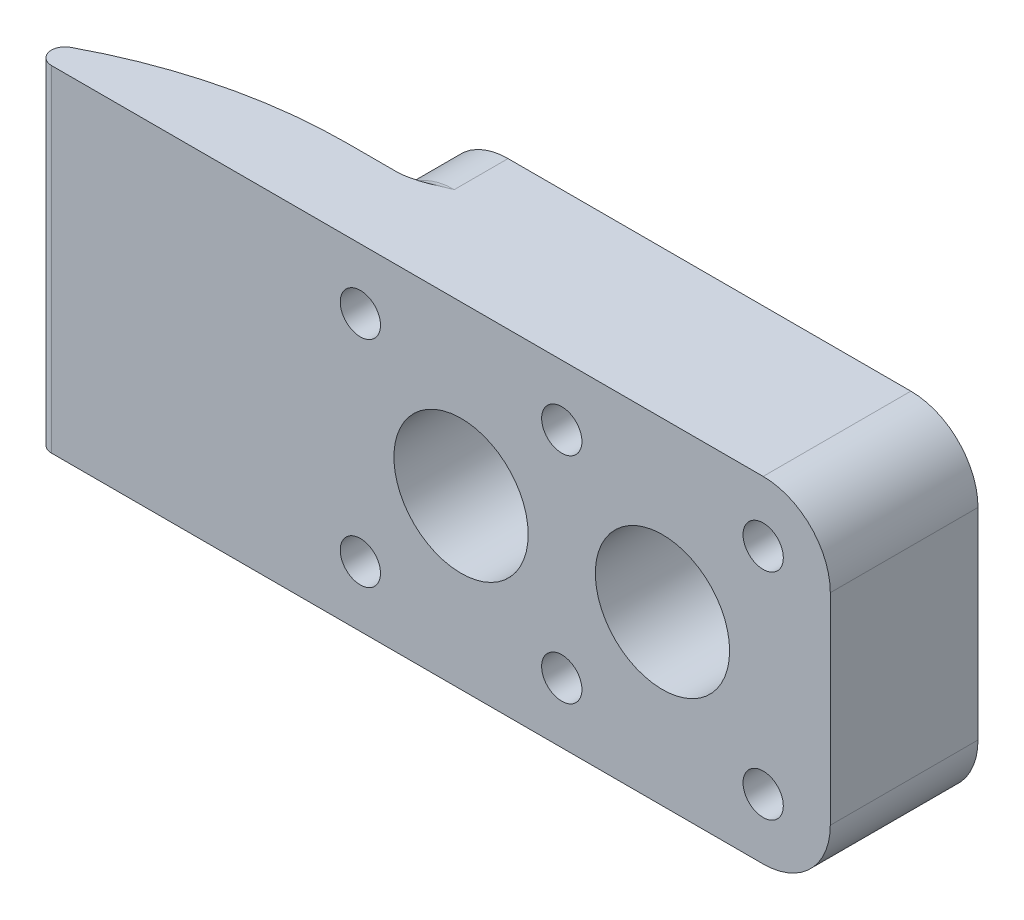
ISO-10303-21;
HEADER;
FILE_DESCRIPTION(('STEP AP214'),'2;1');
FILE_NAME('part.step','',(''),(''),'','','');
FILE_SCHEMA(('AUTOMOTIVE_DESIGN { 1 0 10303 214 1 1 1 1 }'));
ENDSEC;
DATA;
#1=APPLICATION_CONTEXT('core data for automotive mechanical design processes');
#2=APPLICATION_PROTOCOL_DEFINITION('international standard','automotive_design',2000,#1);
#3=PRODUCT_CONTEXT('',#1,'mechanical');
#4=PRODUCT('Part','Part','',(#3));
#5=PRODUCT_RELATED_PRODUCT_CATEGORY('part','',(#4));
#6=PRODUCT_DEFINITION_FORMATION('','',#4);
#7=PRODUCT_DEFINITION_CONTEXT('part definition',#1,'design');
#8=PRODUCT_DEFINITION('design','',#6,#7);
#9=PRODUCT_DEFINITION_SHAPE('','',#8);
#10=(LENGTH_UNIT() NAMED_UNIT(*) SI_UNIT(.MILLI.,.METRE.));
#11=(NAMED_UNIT(*) PLANE_ANGLE_UNIT() SI_UNIT($,.RADIAN.));
#12=(NAMED_UNIT(*) SI_UNIT($,.STERADIAN.) SOLID_ANGLE_UNIT());
#13=UNCERTAINTY_MEASURE_WITH_UNIT(LENGTH_MEASURE(1.E-05),#10,'distance_accuracy_value','');
#14=(GEOMETRIC_REPRESENTATION_CONTEXT(3) GLOBAL_UNCERTAINTY_ASSIGNED_CONTEXT((#13)) GLOBAL_UNIT_ASSIGNED_CONTEXT((#10,
#11,#12)) REPRESENTATION_CONTEXT('',''));
#15=CARTESIAN_POINT('',(0.,0.,0.));
#16=DIRECTION('',(0.,0.,1.));
#17=DIRECTION('',(1.,0.,0.));
#18=AXIS2_PLACEMENT_3D('',#15,#16,#17);
#19=CARTESIAN_POINT('',(20.,-12.5,5.));
#20=DIRECTION('',(-1.,0.,0.));
#21=DIRECTION('',(0.,0.,1.));
#22=AXIS2_PLACEMENT_3D('',#19,#20,#21);
#23=PLANE('',#22);
#24=DIRECTION('',(0.,1.,0.));
#25=VECTOR('',#24,1.);
#26=CARTESIAN_POINT('',(20.,-12.5,11.));
#27=LINE('',#26,#25);
#28=CARTESIAN_POINT('',(20.,-7.5,11.));
#29=VERTEX_POINT('',#28);
#30=CARTESIAN_POINT('',(20.,7.5,11.));
#31=VERTEX_POINT('',#30);
#32=EDGE_CURVE('E186',#29,#31,#27,.T.);
#33=ORIENTED_EDGE('',*,*,#32,.F.);
#34=DIRECTION('',(0.,0.,-1.));
#35=VECTOR('',#34,1.);
#36=CARTESIAN_POINT('',(20.,-7.5,5.));
#37=LINE('',#36,#35);
#38=CARTESIAN_POINT('',(20.,-7.5,0.));
#39=VERTEX_POINT('',#38);
#40=EDGE_CURVE('E230',#29,#39,#37,.T.);
#41=ORIENTED_EDGE('',*,*,#40,.T.);
#42=DIRECTION('',(0.,1.,0.));
#43=VECTOR('',#42,1.);
#44=CARTESIAN_POINT('',(20.,-12.5,0.));
#45=LINE('',#44,#43);
#46=CARTESIAN_POINT('',(20.,7.5,0.));
#47=VERTEX_POINT('',#46);
#48=EDGE_CURVE('E216',#39,#47,#45,.T.);
#49=ORIENTED_EDGE('',*,*,#48,.T.);
#50=DIRECTION('',(0.,0.,-1.));
#51=VECTOR('',#50,1.);
#52=CARTESIAN_POINT('',(20.,7.5,5.));
#53=LINE('',#52,#51);
#54=EDGE_CURVE('E228',#47,#31,#53,.F.);
#55=ORIENTED_EDGE('',*,*,#54,.T.);
#56=EDGE_LOOP('',(#33,#41,#49,#55));
#57=FACE_BOUND('',#56,.T.);
#58=ADVANCED_FACE('F47',(#57),#23,.F.);
#59=CARTESIAN_POINT('',(-20.,12.5,5.));
#60=DIRECTION('',(0.,-1.,0.));
#61=DIRECTION('',(0.,0.,-1.));
#62=AXIS2_PLACEMENT_3D('',#59,#60,#61);
#63=PLANE('',#62);
#64=DIRECTION('',(1.,0.,0.));
#65=VECTOR('',#64,1.);
#66=CARTESIAN_POINT('',(-38.,12.5,11.));
#67=LINE('',#66,#65);
#68=CARTESIAN_POINT('',(-38.,12.5,11.));
#69=VERTEX_POINT('',#68);
#70=CARTESIAN_POINT('',(15.,12.5,11.));
#71=VERTEX_POINT('',#70);
#72=EDGE_CURVE('E173',#69,#71,#67,.T.);
#73=ORIENTED_EDGE('',*,*,#72,.T.);
#74=DIRECTION('',(0.,0.,-1.));
#75=VECTOR('',#74,1.);
#76=CARTESIAN_POINT('',(15.,12.5,5.));
#77=LINE('',#76,#75);
#78=CARTESIAN_POINT('',(15.,12.5,0.));
#79=VERTEX_POINT('',#78);
#80=EDGE_CURVE('E251',#71,#79,#77,.T.);
#81=ORIENTED_EDGE('',*,*,#80,.T.);
#82=DIRECTION('',(-1.,0.,0.));
#83=VECTOR('',#82,1.);
#84=CARTESIAN_POINT('',(-20.,12.5,0.));
#85=LINE('',#84,#83);
#86=CARTESIAN_POINT('',(-15.,12.5,0.));
#87=VERTEX_POINT('',#86);
#88=EDGE_CURVE('E219',#79,#87,#85,.T.);
#89=ORIENTED_EDGE('',*,*,#88,.T.);
#90=DIRECTION('',(0.,0.,-1.));
#91=VECTOR('',#90,1.);
#92=CARTESIAN_POINT('',(-15.,12.5,5.));
#93=LINE('',#92,#91);
#94=CARTESIAN_POINT('',(-15.,12.5,4.));
#95=VERTEX_POINT('',#94);
#96=EDGE_CURVE('E249',#87,#95,#93,.F.);
#97=ORIENTED_EDGE('',*,*,#96,.T.);
#98=CARTESIAN_POINT('',(-18.3166247903554,12.5,5.));
#99=CARTESIAN_POINT('',(-18.2549448261903,12.5,4.99999265512221));
#100=CARTESIAN_POINT('',(-18.193289628128,12.5,4.99825737047964));
#101=CARTESIAN_POINT('',(-18.0701784766119,12.5,4.99167927723074));
#102=CARTESIAN_POINT('',(-18.008722427822,12.5,4.98683828413488));
#103=CARTESIAN_POINT('',(-17.8251331306329,12.5,4.96821224203621));
#104=CARTESIAN_POINT('',(-17.7034115701283,12.5,4.95031992154772));
#105=CARTESIAN_POINT('',(-17.4629728841531,12.5,4.9060386621475));
#106=CARTESIAN_POINT('',(-17.3442374506728,12.5,4.87974501632872));
#107=CARTESIAN_POINT('',(-17.1084146178438,12.5,4.82030252267247));
#108=CARTESIAN_POINT('',(-16.9913286795946,12.5,4.78714796093698));
#109=CARTESIAN_POINT('',(-16.715511240989,12.5,4.70207510058664));
#110=CARTESIAN_POINT('',(-16.5575238418841,12.5,4.64776910285634));
#111=CARTESIAN_POINT('',(-16.2441555047057,12.5,4.53204394783015));
#112=CARTESIAN_POINT('',(-16.0887756970545,12.5,4.47062179236275));
#113=CARTESIAN_POINT('',(-15.6246300367061,12.5,4.27926384080313));
#114=CARTESIAN_POINT('',(-15.3187158206686,12.5,4.14253295536927));
#115=CARTESIAN_POINT('',(-15.0086066187974,12.5,4.00384898305027));
#116=CARTESIAN_POINT('',(-15.0043033038078,12.5,4.00192448179496));
#117=CARTESIAN_POINT('',(-15.,12.5,4.));
#118=B_SPLINE_CURVE_WITH_KNOTS('',3,(#98,#99,#100,#101,#102,#103,#104,#105,#106,#107,#108,#109,
#110,#111,#112,#113,#114,#115,#116,#117),.UNSPECIFIED.,.F.,.F.,(4,2,2,2,2,2,2,2,2,4),(0.,
0.184977192336478,0.369846350576886,0.73848758309796,1.10308764090425,1.46799257532018,
1.96890994139302,2.47003912618659,3.47501470229637,3.48915683792114),.UNSPECIFIED.);
#119=CARTESIAN_POINT('',(-18.3166247903554,12.5,5.));
#120=VERTEX_POINT('',#119);
#121=EDGE_CURVE('E57',#95,#120,#118,.F.);
#122=ORIENTED_EDGE('',*,*,#121,.T.);
#123=DIRECTION('',(-1.,0.,0.));
#124=VECTOR('',#123,1.);
#125=CARTESIAN_POINT('',(-20.,12.5,5.));
#126=LINE('',#125,#124);
#127=CARTESIAN_POINT('',(-22.,12.5,5.));
#128=VERTEX_POINT('',#127);
#129=EDGE_CURVE('E145',#120,#128,#126,.T.);
#130=ORIENTED_EDGE('',*,*,#129,.T.);
#131=CARTESIAN_POINT('',(-22.,12.5,40.));
#132=DIRECTION('',(0.,1.,0.));
#133=DIRECTION('',(0.,0.,-1.));
#134=AXIS2_PLACEMENT_3D('',#131,#132,#133);
#135=CIRCLE('',#134,35.);
#136=CARTESIAN_POINT('',(-38.4705882352941,12.5,9.11764705882354));
#137=VERTEX_POINT('',#136);
#138=EDGE_CURVE('E151',#128,#137,#135,.T.);
#139=ORIENTED_EDGE('',*,*,#138,.T.);
#140=CARTESIAN_POINT('',(-38.,12.5,10.));
#141=DIRECTION('',(0.,1.,0.));
#142=DIRECTION('',(0.,0.,1.));
#143=AXIS2_PLACEMENT_3D('',#140,#141,#142);
#144=CIRCLE('',#143,1.);
#145=EDGE_CURVE('E171',#137,#69,#144,.T.);
#146=ORIENTED_EDGE('',*,*,#145,.T.);
#147=EDGE_LOOP('',(#73,#81,#89,#97,#122,#130,#139,#146));
#148=FACE_BOUND('',#147,.T.);
#149=ADVANCED_FACE('F148',(#148),#63,.F.);
#150=CARTESIAN_POINT('',(-20.,-12.5,5.));
#151=DIRECTION('',(1.,0.,0.));
#152=DIRECTION('',(0.,0.,-1.));
#153=AXIS2_PLACEMENT_3D('',#150,#151,#152);
#154=PLANE('',#153);
#155=DIRECTION('',(0.,0.,-1.));
#156=VECTOR('',#155,1.);
#157=CARTESIAN_POINT('',(-20.,-7.5,5.));
#158=LINE('',#157,#156);
#159=CARTESIAN_POINT('',(-20.,-7.5,0.));
#160=VERTEX_POINT('',#159);
#161=CARTESIAN_POINT('',(-20.,-7.5,4.));
#162=VERTEX_POINT('',#161);
#163=EDGE_CURVE('E256',#160,#162,#158,.F.);
#164=ORIENTED_EDGE('',*,*,#163,.T.);
#165=DIRECTION('',(0.,-1.,0.));
#166=VECTOR('',#165,1.);
#167=CARTESIAN_POINT('',(-20.,-12.5,4.));
#168=LINE('',#167,#166);
#169=CARTESIAN_POINT('',(-20.,7.5,4.));
#170=VERTEX_POINT('',#169);
#171=EDGE_CURVE('E267',#162,#170,#168,.F.);
#172=ORIENTED_EDGE('',*,*,#171,.T.);
#173=DIRECTION('',(0.,0.,-1.));
#174=VECTOR('',#173,1.);
#175=CARTESIAN_POINT('',(-20.,7.5,5.));
#176=LINE('',#175,#174);
#177=CARTESIAN_POINT('',(-20.,7.5,0.));
#178=VERTEX_POINT('',#177);
#179=EDGE_CURVE('E254',#170,#178,#176,.T.);
#180=ORIENTED_EDGE('',*,*,#179,.T.);
#181=DIRECTION('',(0.,-1.,0.));
#182=VECTOR('',#181,1.);
#183=CARTESIAN_POINT('',(-20.,-12.5,0.));
#184=LINE('',#183,#182);
#185=EDGE_CURVE('E222',#178,#160,#184,.T.);
#186=ORIENTED_EDGE('',*,*,#185,.T.);
#187=EDGE_LOOP('',(#164,#172,#180,#186));
#188=FACE_BOUND('',#187,.T.);
#189=ADVANCED_FACE('F287',(#188),#154,.F.);
#190=CARTESIAN_POINT('',(-20.,-12.5,5.));
#191=DIRECTION('',(0.,1.,0.));
#192=DIRECTION('',(0.,0.,1.));
#193=AXIS2_PLACEMENT_3D('',#190,#191,#192);
#194=PLANE('',#193);
#195=DIRECTION('',(1.,0.,0.));
#196=VECTOR('',#195,1.);
#197=CARTESIAN_POINT('',(-20.,-12.5,0.));
#198=LINE('',#197,#196);
#199=CARTESIAN_POINT('',(-15.,-12.5,0.));
#200=VERTEX_POINT('',#199);
#201=CARTESIAN_POINT('',(15.,-12.5,0.));
#202=VERTEX_POINT('',#201);
#203=EDGE_CURVE('E225',#200,#202,#198,.T.);
#204=ORIENTED_EDGE('',*,*,#203,.T.);
#205=DIRECTION('',(0.,0.,-1.));
#206=VECTOR('',#205,1.);
#207=CARTESIAN_POINT('',(15.,-12.5,5.));
#208=LINE('',#207,#206);
#209=CARTESIAN_POINT('',(15.,-12.5,11.));
#210=VERTEX_POINT('',#209);
#211=EDGE_CURVE('E243',#202,#210,#208,.F.);
#212=ORIENTED_EDGE('',*,*,#211,.T.);
#213=DIRECTION('',(1.,0.,0.));
#214=VECTOR('',#213,1.);
#215=CARTESIAN_POINT('',(-38.,-12.5,11.));
#216=LINE('',#215,#214);
#217=CARTESIAN_POINT('',(-38.,-12.5,11.));
#218=VERTEX_POINT('',#217);
#219=EDGE_CURVE('E168',#218,#210,#216,.T.);
#220=ORIENTED_EDGE('',*,*,#219,.F.);
#221=CARTESIAN_POINT('',(-38.,-12.5,10.));
#222=DIRECTION('',(0.,1.,0.));
#223=DIRECTION('',(0.,0.,1.));
#224=AXIS2_PLACEMENT_3D('',#221,#222,#223);
#225=CIRCLE('',#224,1.);
#226=CARTESIAN_POINT('',(-38.4705882352941,-12.5,9.11764705882354));
#227=VERTEX_POINT('',#226);
#228=EDGE_CURVE('E181',#227,#218,#225,.T.);
#229=ORIENTED_EDGE('',*,*,#228,.F.);
#230=CARTESIAN_POINT('',(-22.,-12.5,40.));
#231=DIRECTION('',(0.,1.,0.));
#232=DIRECTION('',(0.,0.,-1.));
#233=AXIS2_PLACEMENT_3D('',#230,#231,#232);
#234=CIRCLE('',#233,35.);
#235=CARTESIAN_POINT('',(-22.,-12.5,5.));
#236=VERTEX_POINT('',#235);
#237=EDGE_CURVE('E179',#236,#227,#234,.T.);
#238=ORIENTED_EDGE('',*,*,#237,.F.);
#239=DIRECTION('',(-1.,0.,0.));
#240=VECTOR('',#239,1.);
#241=CARTESIAN_POINT('',(-20.,-12.5,5.));
#242=LINE('',#241,#240);
#243=CARTESIAN_POINT('',(-18.3166247903554,-12.5,5.));
#244=VERTEX_POINT('',#243);
#245=EDGE_CURVE('E163',#244,#236,#242,.T.);
#246=ORIENTED_EDGE('',*,*,#245,.F.);
#247=CARTESIAN_POINT('',(-18.3166247903554,-12.5,5.));
#248=CARTESIAN_POINT('',(-18.2549448261902,-12.5,4.99999265512221));
#249=CARTESIAN_POINT('',(-18.1932896281279,-12.5,4.99825737047964));
#250=CARTESIAN_POINT('',(-18.0701784766117,-12.5,4.99167927723073));
#251=CARTESIAN_POINT('',(-18.0087224278218,-12.5,4.98683828413486));
#252=CARTESIAN_POINT('',(-17.8251331306325,-12.5,4.96821224203616));
#253=CARTESIAN_POINT('',(-17.7034115701279,-12.5,4.95031992154765));
#254=CARTESIAN_POINT('',(-17.4629728841526,-12.5,4.9060386621474));
#255=CARTESIAN_POINT('',(-17.3442374506725,-12.5,4.87974501632863));
#256=CARTESIAN_POINT('',(-17.1084146178436,-12.5,4.82030252267242));
#257=CARTESIAN_POINT('',(-16.9913286795945,-12.5,4.78714796093697));
#258=CARTESIAN_POINT('',(-16.715511240989,-12.5,4.70207510058662));
#259=CARTESIAN_POINT('',(-16.5575238418842,-12.5,4.64776910285627));
#260=CARTESIAN_POINT('',(-16.2441555047057,-12.5,4.53204394783025));
#261=CARTESIAN_POINT('',(-16.0887756970544,-12.5,4.4706217923631));
#262=CARTESIAN_POINT('',(-15.6246300367064,-12.5,4.27926384080253));
#263=CARTESIAN_POINT('',(-15.3187158206702,-12.5,4.14253295536583));
#264=CARTESIAN_POINT('',(-15.0086066187975,-12.5,4.00384898305017));
#265=CARTESIAN_POINT('',(-15.0043033038078,-12.5,4.00192448179491));
#266=CARTESIAN_POINT('',(-15.,-12.5,4.));
#267=B_SPLINE_CURVE_WITH_KNOTS('',3,(#247,#248,#249,#250,#251,#252,#253,#254,#255,#256,#257,
#258,#259,#260,#261,#262,#263,#264,#265,#266),.UNSPECIFIED.,.F.,.F.,(4,2,2,2,2,2,2,2,2,4),(0.,
0.184977192336631,0.369846350577189,0.73848758309851,1.1030876409045,1.46799257532018,
1.96890994139298,2.47003912618646,3.47501470229638,3.48915683792114),.UNSPECIFIED.);
#268=CARTESIAN_POINT('',(-15.,-12.5,4.));
#269=VERTEX_POINT('',#268);
#270=EDGE_CURVE('E11',#244,#269,#267,.T.);
#271=ORIENTED_EDGE('',*,*,#270,.T.);
#272=DIRECTION('',(0.,0.,-1.));
#273=VECTOR('',#272,1.);
#274=CARTESIAN_POINT('',(-15.,-12.5,5.));
#275=LINE('',#274,#273);
#276=EDGE_CURVE('E241',#269,#200,#275,.T.);
#277=ORIENTED_EDGE('',*,*,#276,.T.);
#278=EDGE_LOOP('',(#204,#212,#220,#229,#238,#246,#271,#277));
#279=FACE_BOUND('',#278,.T.);
#280=ADVANCED_FACE('F385',(#279),#194,.F.);
#281=CARTESIAN_POINT('',(0.,0.,0.));
#282=DIRECTION('',(0.,0.,-1.));
#283=DIRECTION('',(-1.,0.,0.));
#284=AXIS2_PLACEMENT_3D('',#281,#282,#283);
#285=PLANE('',#284);
#286=CARTESIAN_POINT('',(-7.5,0.,0.));
#287=DIRECTION('',(0.,0.,1.));
#288=DIRECTION('',(1.,0.,0.));
#289=AXIS2_PLACEMENT_3D('',#286,#287,#288);
#290=CIRCLE('',#289,5.);
#291=CARTESIAN_POINT('',(-2.5,0.,0.));
#292=VERTEX_POINT('',#291);
#293=EDGE_CURVE('E193',#292,#292,#290,.T.);
#294=ORIENTED_EDGE('',*,*,#293,.T.);
#295=EDGE_LOOP('',(#294));
#296=FACE_BOUND('',#295,.T.);
#297=CARTESIAN_POINT('',(7.5,0.,0.));
#298=DIRECTION('',(0.,0.,1.));
#299=DIRECTION('',(-1.,0.,0.));
#300=AXIS2_PLACEMENT_3D('',#297,#298,#299);
#301=CIRCLE('',#300,5.);
#302=CARTESIAN_POINT('',(2.5,0.,0.));
#303=VERTEX_POINT('',#302);
#304=EDGE_CURVE('E189',#303,#303,#301,.T.);
#305=ORIENTED_EDGE('',*,*,#304,.T.);
#306=EDGE_LOOP('',(#305));
#307=FACE_BOUND('',#306,.T.);
#308=CARTESIAN_POINT('',(-15.,-8.,0.));
#309=DIRECTION('',(0.,0.,1.));
#310=DIRECTION('',(-1.,0.,0.));
#311=AXIS2_PLACEMENT_3D('',#308,#309,#310);
#312=CIRCLE('',#311,1.5);
#313=CARTESIAN_POINT('',(-16.5,-8.,0.));
#314=VERTEX_POINT('',#313);
#315=EDGE_CURVE('E196',#314,#314,#312,.T.);
#316=ORIENTED_EDGE('',*,*,#315,.T.);
#317=EDGE_LOOP('',(#316));
#318=FACE_BOUND('',#317,.T.);
#319=CARTESIAN_POINT('',(0.,-8.,0.));
#320=DIRECTION('',(0.,0.,1.));
#321=DIRECTION('',(-1.,0.,0.));
#322=AXIS2_PLACEMENT_3D('',#319,#320,#321);
#323=CIRCLE('',#322,1.5);
#324=CARTESIAN_POINT('',(-1.5,-8.,0.));
#325=VERTEX_POINT('',#324);
#326=EDGE_CURVE('E209',#325,#325,#323,.T.);
#327=ORIENTED_EDGE('',*,*,#326,.T.);
#328=EDGE_LOOP('',(#327));
#329=FACE_BOUND('',#328,.T.);
#330=CARTESIAN_POINT('',(15.,-8.,0.));
#331=DIRECTION('',(0.,0.,1.));
#332=DIRECTION('',(1.,0.,0.));
#333=AXIS2_PLACEMENT_3D('',#330,#331,#332);
#334=CIRCLE('',#333,1.5);
#335=CARTESIAN_POINT('',(16.5,-8.,0.));
#336=VERTEX_POINT('',#335);
#337=EDGE_CURVE('E206',#336,#336,#334,.T.);
#338=ORIENTED_EDGE('',*,*,#337,.T.);
#339=EDGE_LOOP('',(#338));
#340=FACE_BOUND('',#339,.T.);
#341=CARTESIAN_POINT('',(15.,8.,0.));
#342=DIRECTION('',(0.,0.,1.));
#343=DIRECTION('',(-1.,0.,0.));
#344=AXIS2_PLACEMENT_3D('',#341,#342,#343);
#345=CIRCLE('',#344,1.5);
#346=CARTESIAN_POINT('',(13.5,8.,0.));
#347=VERTEX_POINT('',#346);
#348=EDGE_CURVE('E203',#347,#347,#345,.T.);
#349=ORIENTED_EDGE('',*,*,#348,.T.);
#350=EDGE_LOOP('',(#349));
#351=FACE_BOUND('',#350,.T.);
#352=CARTESIAN_POINT('',(0.,8.,0.));
#353=DIRECTION('',(0.,0.,1.));
#354=DIRECTION('',(1.,0.,0.));
#355=AXIS2_PLACEMENT_3D('',#352,#353,#354);
#356=CIRCLE('',#355,1.5);
#357=CARTESIAN_POINT('',(1.5,8.,0.));
#358=VERTEX_POINT('',#357);
#359=EDGE_CURVE('E199',#358,#358,#356,.T.);
#360=ORIENTED_EDGE('',*,*,#359,.T.);
#361=EDGE_LOOP('',(#360));
#362=FACE_BOUND('',#361,.T.);
#363=CARTESIAN_POINT('',(-15.,8.,0.));
#364=DIRECTION('',(0.,0.,1.));
#365=DIRECTION('',(1.,0.,0.));
#366=AXIS2_PLACEMENT_3D('',#363,#364,#365);
#367=CIRCLE('',#366,1.5);
#368=CARTESIAN_POINT('',(-13.5,8.,0.));
#369=VERTEX_POINT('',#368);
#370=EDGE_CURVE('E202',#369,#369,#367,.T.);
#371=ORIENTED_EDGE('',*,*,#370,.T.);
#372=EDGE_LOOP('',(#371));
#373=FACE_BOUND('',#372,.T.);
#374=ORIENTED_EDGE('',*,*,#48,.F.);
#375=CARTESIAN_POINT('',(15.,-7.5,0.));
#376=DIRECTION('',(0.,0.,-1.));
#377=DIRECTION('',(-1.,0.,0.));
#378=AXIS2_PLACEMENT_3D('',#375,#376,#377);
#379=CIRCLE('',#378,5.);
#380=EDGE_CURVE('E239',#39,#202,#379,.T.);
#381=ORIENTED_EDGE('',*,*,#380,.T.);
#382=ORIENTED_EDGE('',*,*,#203,.F.);
#383=CARTESIAN_POINT('',(-15.,-7.5,0.));
#384=DIRECTION('',(0.,0.,-1.));
#385=DIRECTION('',(-1.,0.,0.));
#386=AXIS2_PLACEMENT_3D('',#383,#384,#385);
#387=CIRCLE('',#386,5.);
#388=EDGE_CURVE('E235',#200,#160,#387,.T.);
#389=ORIENTED_EDGE('',*,*,#388,.T.);
#390=ORIENTED_EDGE('',*,*,#185,.F.);
#391=CARTESIAN_POINT('',(-15.,7.5,0.));
#392=DIRECTION('',(0.,0.,-1.));
#393=DIRECTION('',(-1.,0.,0.));
#394=AXIS2_PLACEMENT_3D('',#391,#392,#393);
#395=CIRCLE('',#394,5.);
#396=EDGE_CURVE('E233',#178,#87,#395,.T.);
#397=ORIENTED_EDGE('',*,*,#396,.T.);
#398=ORIENTED_EDGE('',*,*,#88,.F.);
#399=CARTESIAN_POINT('',(15.,7.5,0.));
#400=DIRECTION('',(0.,0.,-1.));
#401=DIRECTION('',(-1.,0.,0.));
#402=AXIS2_PLACEMENT_3D('',#399,#400,#401);
#403=CIRCLE('',#402,5.);
#404=EDGE_CURVE('E237',#79,#47,#403,.T.);
#405=ORIENTED_EDGE('',*,*,#404,.T.);
#406=EDGE_LOOP('',(#374,#381,#382,#389,#390,#397,#398,#405));
#407=FACE_BOUND('',#406,.T.);
#408=ADVANCED_FACE('F379',(#296,#307,#318,#329,#340,#351,#362,#373,#407),#285,.T.);
#409=CARTESIAN_POINT('',(-15.,8.,0.));
#410=DIRECTION('',(0.,0.,1.));
#411=DIRECTION('',(1.,0.,0.));
#412=AXIS2_PLACEMENT_3D('',#409,#410,#411);
#413=CYLINDRICAL_SURFACE('',#412,1.5);
#414=ORIENTED_EDGE('',*,*,#370,.F.);
#415=EDGE_LOOP('',(#414));
#416=FACE_BOUND('',#415,.T.);
#417=CARTESIAN_POINT('',(-15.,8.,11.));
#418=DIRECTION('',(0.,0.,1.));
#419=DIRECTION('',(1.,0.,0.));
#420=AXIS2_PLACEMENT_3D('',#417,#418,#419);
#421=CIRCLE('',#420,1.5);
#422=CARTESIAN_POINT('',(-13.5,8.,11.));
#423=VERTEX_POINT('',#422);
#424=EDGE_CURVE('E325',#423,#423,#421,.T.);
#425=ORIENTED_EDGE('',*,*,#424,.T.);
#426=EDGE_LOOP('',(#425));
#427=FACE_BOUND('',#426,.T.);
#428=ADVANCED_FACE('F393',(#416,#427),#413,.F.);
#429=CARTESIAN_POINT('',(0.,8.,0.));
#430=DIRECTION('',(0.,0.,1.));
#431=DIRECTION('',(1.,0.,0.));
#432=AXIS2_PLACEMENT_3D('',#429,#430,#431);
#433=CYLINDRICAL_SURFACE('',#432,1.5);
#434=ORIENTED_EDGE('',*,*,#359,.F.);
#435=EDGE_LOOP('',(#434));
#436=FACE_BOUND('',#435,.T.);
#437=CARTESIAN_POINT('',(0.,8.,11.));
#438=DIRECTION('',(0.,0.,1.));
#439=DIRECTION('',(1.,0.,0.));
#440=AXIS2_PLACEMENT_3D('',#437,#438,#439);
#441=CIRCLE('',#440,1.5);
#442=CARTESIAN_POINT('',(1.5,8.,11.));
#443=VERTEX_POINT('',#442);
#444=EDGE_CURVE('E330',#443,#443,#441,.T.);
#445=ORIENTED_EDGE('',*,*,#444,.T.);
#446=EDGE_LOOP('',(#445));
#447=FACE_BOUND('',#446,.T.);
#448=ADVANCED_FACE('F353',(#436,#447),#433,.F.);
#449=CARTESIAN_POINT('',(15.,8.,0.));
#450=DIRECTION('',(0.,0.,1.));
#451=DIRECTION('',(1.,0.,0.));
#452=AXIS2_PLACEMENT_3D('',#449,#450,#451);
#453=CYLINDRICAL_SURFACE('',#452,1.5);
#454=ORIENTED_EDGE('',*,*,#348,.F.);
#455=EDGE_LOOP('',(#454));
#456=FACE_BOUND('',#455,.T.);
#457=CARTESIAN_POINT('',(15.,8.,11.));
#458=DIRECTION('',(0.,0.,1.));
#459=DIRECTION('',(1.,0.,0.));
#460=AXIS2_PLACEMENT_3D('',#457,#458,#459);
#461=CIRCLE('',#460,1.5);
#462=CARTESIAN_POINT('',(16.5,8.,11.));
#463=VERTEX_POINT('',#462);
#464=EDGE_CURVE('E322',#463,#463,#461,.T.);
#465=ORIENTED_EDGE('',*,*,#464,.T.);
#466=EDGE_LOOP('',(#465));
#467=FACE_BOUND('',#466,.T.);
#468=ADVANCED_FACE('F413',(#456,#467),#453,.F.);
#469=CARTESIAN_POINT('',(15.,-8.,0.));
#470=DIRECTION('',(0.,0.,1.));
#471=DIRECTION('',(1.,0.,0.));
#472=AXIS2_PLACEMENT_3D('',#469,#470,#471);
#473=CYLINDRICAL_SURFACE('',#472,1.5);
#474=ORIENTED_EDGE('',*,*,#337,.F.);
#475=EDGE_LOOP('',(#474));
#476=FACE_BOUND('',#475,.T.);
#477=CARTESIAN_POINT('',(15.,-8.,11.));
#478=DIRECTION('',(0.,0.,1.));
#479=DIRECTION('',(1.,0.,0.));
#480=AXIS2_PLACEMENT_3D('',#477,#478,#479);
#481=CIRCLE('',#480,1.5);
#482=CARTESIAN_POINT('',(16.5,-8.,11.));
#483=VERTEX_POINT('',#482);
#484=EDGE_CURVE('E348',#483,#483,#481,.T.);
#485=ORIENTED_EDGE('',*,*,#484,.T.);
#486=EDGE_LOOP('',(#485));
#487=FACE_BOUND('',#486,.T.);
#488=ADVANCED_FACE('F409',(#476,#487),#473,.F.);
#489=CARTESIAN_POINT('',(0.,-8.,0.));
#490=DIRECTION('',(0.,0.,1.));
#491=DIRECTION('',(1.,0.,0.));
#492=AXIS2_PLACEMENT_3D('',#489,#490,#491);
#493=CYLINDRICAL_SURFACE('',#492,1.5);
#494=ORIENTED_EDGE('',*,*,#326,.F.);
#495=EDGE_LOOP('',(#494));
#496=FACE_BOUND('',#495,.T.);
#497=CARTESIAN_POINT('',(0.,-8.,11.));
#498=DIRECTION('',(0.,0.,1.));
#499=DIRECTION('',(1.,0.,0.));
#500=AXIS2_PLACEMENT_3D('',#497,#498,#499);
#501=CIRCLE('',#500,1.5);
#502=CARTESIAN_POINT('',(1.5,-8.,11.));
#503=VERTEX_POINT('',#502);
#504=EDGE_CURVE('E343',#503,#503,#501,.T.);
#505=ORIENTED_EDGE('',*,*,#504,.T.);
#506=EDGE_LOOP('',(#505));
#507=FACE_BOUND('',#506,.T.);
#508=ADVANCED_FACE('F405',(#496,#507),#493,.F.);
#509=CARTESIAN_POINT('',(-15.,-8.,0.));
#510=DIRECTION('',(0.,0.,1.));
#511=DIRECTION('',(1.,0.,0.));
#512=AXIS2_PLACEMENT_3D('',#509,#510,#511);
#513=CYLINDRICAL_SURFACE('',#512,1.5);
#514=ORIENTED_EDGE('',*,*,#315,.F.);
#515=EDGE_LOOP('',(#514));
#516=FACE_BOUND('',#515,.T.);
#517=CARTESIAN_POINT('',(-15.,-8.,11.));
#518=DIRECTION('',(0.,0.,1.));
#519=DIRECTION('',(1.,0.,0.));
#520=AXIS2_PLACEMENT_3D('',#517,#518,#519);
#521=CIRCLE('',#520,1.5);
#522=CARTESIAN_POINT('',(-13.5,-8.,11.));
#523=VERTEX_POINT('',#522);
#524=EDGE_CURVE('E334',#523,#523,#521,.T.);
#525=ORIENTED_EDGE('',*,*,#524,.T.);
#526=EDGE_LOOP('',(#525));
#527=FACE_BOUND('',#526,.T.);
#528=ADVANCED_FACE('F401',(#516,#527),#513,.F.);
#529=CARTESIAN_POINT('',(7.5,0.,0.));
#530=DIRECTION('',(0.,0.,1.));
#531=DIRECTION('',(1.,0.,0.));
#532=AXIS2_PLACEMENT_3D('',#529,#530,#531);
#533=CYLINDRICAL_SURFACE('',#532,5.);
#534=ORIENTED_EDGE('',*,*,#304,.F.);
#535=EDGE_LOOP('',(#534));
#536=FACE_BOUND('',#535,.T.);
#537=CARTESIAN_POINT('',(7.5,0.,11.));
#538=DIRECTION('',(0.,0.,1.));
#539=DIRECTION('',(1.,0.,0.));
#540=AXIS2_PLACEMENT_3D('',#537,#538,#539);
#541=CIRCLE('',#540,5.);
#542=CARTESIAN_POINT('',(12.5,0.,11.));
#543=VERTEX_POINT('',#542);
#544=EDGE_CURVE('E158',#543,#543,#541,.T.);
#545=ORIENTED_EDGE('',*,*,#544,.T.);
#546=EDGE_LOOP('',(#545));
#547=FACE_BOUND('',#546,.T.);
#548=ADVANCED_FACE('F404',(#536,#547),#533,.F.);
#549=CARTESIAN_POINT('',(-7.5,0.,0.));
#550=DIRECTION('',(0.,0.,1.));
#551=DIRECTION('',(1.,0.,0.));
#552=AXIS2_PLACEMENT_3D('',#549,#550,#551);
#553=CYLINDRICAL_SURFACE('',#552,5.);
#554=ORIENTED_EDGE('',*,*,#293,.F.);
#555=EDGE_LOOP('',(#554));
#556=FACE_BOUND('',#555,.T.);
#557=CARTESIAN_POINT('',(-7.5,0.,11.));
#558=DIRECTION('',(0.,0.,1.));
#559=DIRECTION('',(1.,0.,0.));
#560=AXIS2_PLACEMENT_3D('',#557,#558,#559);
#561=CIRCLE('',#560,5.);
#562=CARTESIAN_POINT('',(-2.5,0.,11.));
#563=VERTEX_POINT('',#562);
#564=EDGE_CURVE('E338',#563,#563,#561,.T.);
#565=ORIENTED_EDGE('',*,*,#564,.T.);
#566=EDGE_LOOP('',(#565));
#567=FACE_BOUND('',#566,.T.);
#568=ADVANCED_FACE('F423',(#556,#567),#553,.F.);
#569=CARTESIAN_POINT('',(-20.,-12.5,5.));
#570=DIRECTION('',(0.,0.,-1.));
#571=DIRECTION('',(-1.,0.,0.));
#572=AXIS2_PLACEMENT_3D('',#569,#570,#571);
#573=PLANE('',#572);
#574=ORIENTED_EDGE('',*,*,#129,.F.);
#575=CARTESIAN_POINT('',(-15.,7.5,5.));
#576=DIRECTION('',(0.,0.,-1.));
#577=DIRECTION('',(-1.,0.,0.));
#578=AXIS2_PLACEMENT_3D('',#575,#576,#577);
#579=CIRCLE('',#578,6.);
#580=CARTESIAN_POINT('',(-21.,7.5,5.));
#581=VERTEX_POINT('',#580);
#582=EDGE_CURVE('E262',#120,#581,#579,.F.);
#583=ORIENTED_EDGE('',*,*,#582,.T.);
#584=DIRECTION('',(0.,-1.,0.));
#585=VECTOR('',#584,1.);
#586=CARTESIAN_POINT('',(-21.,-12.5,5.));
#587=LINE('',#586,#585);
#588=CARTESIAN_POINT('',(-21.,-7.5,5.));
#589=VERTEX_POINT('',#588);
#590=EDGE_CURVE('E258',#581,#589,#587,.T.);
#591=ORIENTED_EDGE('',*,*,#590,.T.);
#592=CARTESIAN_POINT('',(-15.,-7.5,5.));
#593=DIRECTION('',(0.,0.,-1.));
#594=DIRECTION('',(-1.,0.,0.));
#595=AXIS2_PLACEMENT_3D('',#592,#593,#594);
#596=CIRCLE('',#595,6.);
#597=EDGE_CURVE('E260',#589,#244,#596,.F.);
#598=ORIENTED_EDGE('',*,*,#597,.T.);
#599=ORIENTED_EDGE('',*,*,#245,.T.);
#600=DIRECTION('',(0.,1.,0.));
#601=VECTOR('',#600,1.);
#602=CARTESIAN_POINT('',(-22.,-12.5,5.));
#603=LINE('',#602,#601);
#604=EDGE_CURVE('E161',#236,#128,#603,.T.);
#605=ORIENTED_EDGE('',*,*,#604,.T.);
#606=EDGE_LOOP('',(#574,#583,#591,#598,#599,#605));
#607=FACE_BOUND('',#606,.T.);
#608=ADVANCED_FACE('F162',(#607),#573,.T.);
#609=CARTESIAN_POINT('',(-38.,-12.5,11.));
#610=DIRECTION('',(0.,0.,1.));
#611=DIRECTION('',(1.,0.,0.));
#612=AXIS2_PLACEMENT_3D('',#609,#610,#611);
#613=PLANE('',#612);
#614=ORIENTED_EDGE('',*,*,#464,.F.);
#615=EDGE_LOOP('',(#614));
#616=FACE_BOUND('',#615,.T.);
#617=ORIENTED_EDGE('',*,*,#424,.F.);
#618=EDGE_LOOP('',(#617));
#619=FACE_BOUND('',#618,.T.);
#620=ORIENTED_EDGE('',*,*,#444,.F.);
#621=EDGE_LOOP('',(#620));
#622=FACE_BOUND('',#621,.T.);
#623=ORIENTED_EDGE('',*,*,#484,.F.);
#624=EDGE_LOOP('',(#623));
#625=FACE_BOUND('',#624,.T.);
#626=ORIENTED_EDGE('',*,*,#504,.F.);
#627=EDGE_LOOP('',(#626));
#628=FACE_BOUND('',#627,.T.);
#629=ORIENTED_EDGE('',*,*,#564,.F.);
#630=EDGE_LOOP('',(#629));
#631=FACE_BOUND('',#630,.T.);
#632=ORIENTED_EDGE('',*,*,#524,.F.);
#633=EDGE_LOOP('',(#632));
#634=FACE_BOUND('',#633,.T.);
#635=ORIENTED_EDGE('',*,*,#544,.F.);
#636=EDGE_LOOP('',(#635));
#637=FACE_BOUND('',#636,.T.);
#638=ORIENTED_EDGE('',*,*,#219,.T.);
#639=CARTESIAN_POINT('',(15.,-7.5,11.));
#640=DIRECTION('',(0.,0.,1.));
#641=DIRECTION('',(1.,0.,0.));
#642=AXIS2_PLACEMENT_3D('',#639,#640,#641);
#643=CIRCLE('',#642,5.);
#644=EDGE_CURVE('E247',#210,#29,#643,.T.);
#645=ORIENTED_EDGE('',*,*,#644,.T.);
#646=ORIENTED_EDGE('',*,*,#32,.T.);
#647=CARTESIAN_POINT('',(15.,7.5,11.));
#648=DIRECTION('',(0.,0.,1.));
#649=DIRECTION('',(1.,0.,0.));
#650=AXIS2_PLACEMENT_3D('',#647,#648,#649);
#651=CIRCLE('',#650,5.);
#652=EDGE_CURVE('E245',#31,#71,#651,.T.);
#653=ORIENTED_EDGE('',*,*,#652,.T.);
#654=ORIENTED_EDGE('',*,*,#72,.F.);
#655=DIRECTION('',(0.,1.,0.));
#656=VECTOR('',#655,1.);
#657=CARTESIAN_POINT('',(-38.,-12.5,11.));
#658=LINE('',#657,#656);
#659=EDGE_CURVE('E190',#218,#69,#658,.T.);
#660=ORIENTED_EDGE('',*,*,#659,.F.);
#661=EDGE_LOOP('',(#638,#645,#646,#653,#654,#660));
#662=FACE_BOUND('',#661,.T.);
#663=ADVANCED_FACE('F355',(#616,#619,#622,#625,#628,#631,#634,#637,#662),#613,.T.);
#664=CARTESIAN_POINT('',(-38.,-12.5,10.));
#665=DIRECTION('',(0.,1.,0.));
#666=DIRECTION('',(0.,0.,1.));
#667=AXIS2_PLACEMENT_3D('',#664,#665,#666);
#668=CYLINDRICAL_SURFACE('',#667,1.);
#669=ORIENTED_EDGE('',*,*,#659,.T.);
#670=ORIENTED_EDGE('',*,*,#145,.F.);
#671=DIRECTION('',(0.,1.,0.));
#672=VECTOR('',#671,1.);
#673=CARTESIAN_POINT('',(-38.4705882352941,-12.5,9.11764705882354));
#674=LINE('',#673,#672);
#675=EDGE_CURVE('E167',#227,#137,#674,.T.);
#676=ORIENTED_EDGE('',*,*,#675,.F.);
#677=ORIENTED_EDGE('',*,*,#228,.T.);
#678=EDGE_LOOP('',(#669,#670,#676,#677));
#679=FACE_BOUND('',#678,.T.);
#680=ADVANCED_FACE('F358',(#679),#668,.T.);
#681=CARTESIAN_POINT('',(-22.,-12.5,40.));
#682=DIRECTION('',(0.,1.,0.));
#683=DIRECTION('',(0.,0.,1.));
#684=AXIS2_PLACEMENT_3D('',#681,#682,#683);
#685=CYLINDRICAL_SURFACE('',#684,35.);
#686=ORIENTED_EDGE('',*,*,#675,.T.);
#687=ORIENTED_EDGE('',*,*,#138,.F.);
#688=ORIENTED_EDGE('',*,*,#604,.F.);
#689=ORIENTED_EDGE('',*,*,#237,.T.);
#690=EDGE_LOOP('',(#686,#687,#688,#689));
#691=FACE_BOUND('',#690,.T.);
#692=ADVANCED_FACE('F170',(#691),#685,.T.);
#693=CARTESIAN_POINT('',(15.,-7.5,5.));
#694=DIRECTION('',(0.,0.,-1.));
#695=DIRECTION('',(-1.,0.,0.));
#696=AXIS2_PLACEMENT_3D('',#693,#694,#695);
#697=CYLINDRICAL_SURFACE('',#696,5.);
#698=ORIENTED_EDGE('',*,*,#644,.F.);
#699=ORIENTED_EDGE('',*,*,#211,.F.);
#700=ORIENTED_EDGE('',*,*,#380,.F.);
#701=ORIENTED_EDGE('',*,*,#40,.F.);
#702=EDGE_LOOP('',(#698,#699,#700,#701));
#703=FACE_BOUND('',#702,.T.);
#704=ADVANCED_FACE('F291',(#703),#697,.T.);
#705=CARTESIAN_POINT('',(15.,7.5,5.));
#706=DIRECTION('',(0.,0.,-1.));
#707=DIRECTION('',(-1.,0.,0.));
#708=AXIS2_PLACEMENT_3D('',#705,#706,#707);
#709=CYLINDRICAL_SURFACE('',#708,5.);
#710=ORIENTED_EDGE('',*,*,#652,.F.);
#711=ORIENTED_EDGE('',*,*,#54,.F.);
#712=ORIENTED_EDGE('',*,*,#404,.F.);
#713=ORIENTED_EDGE('',*,*,#80,.F.);
#714=EDGE_LOOP('',(#710,#711,#712,#713));
#715=FACE_BOUND('',#714,.T.);
#716=ADVANCED_FACE('F294',(#715),#709,.T.);
#717=CARTESIAN_POINT('',(-15.,-7.5,5.));
#718=DIRECTION('',(0.,0.,-1.));
#719=DIRECTION('',(-1.,0.,0.));
#720=AXIS2_PLACEMENT_3D('',#717,#718,#719);
#721=CYLINDRICAL_SURFACE('',#720,5.);
#722=ORIENTED_EDGE('',*,*,#276,.F.);
#723=CARTESIAN_POINT('',(-15.,-7.5,4.));
#724=DIRECTION('',(0.,0.,-1.));
#725=DIRECTION('',(-1.,0.,0.));
#726=AXIS2_PLACEMENT_3D('',#723,#724,#725);
#727=CIRCLE('',#726,5.);
#728=EDGE_CURVE('E70',#269,#162,#727,.T.);
#729=ORIENTED_EDGE('',*,*,#728,.T.);
#730=ORIENTED_EDGE('',*,*,#163,.F.);
#731=ORIENTED_EDGE('',*,*,#388,.F.);
#732=EDGE_LOOP('',(#722,#729,#730,#731));
#733=FACE_BOUND('',#732,.T.);
#734=ADVANCED_FACE('F298',(#733),#721,.T.);
#735=CARTESIAN_POINT('',(-15.,7.5,5.));
#736=DIRECTION('',(0.,0.,-1.));
#737=DIRECTION('',(-1.,0.,0.));
#738=AXIS2_PLACEMENT_3D('',#735,#736,#737);
#739=CYLINDRICAL_SURFACE('',#738,5.);
#740=ORIENTED_EDGE('',*,*,#179,.F.);
#741=CARTESIAN_POINT('',(-15.,7.5,4.));
#742=DIRECTION('',(0.,0.,-1.));
#743=DIRECTION('',(-1.,0.,0.));
#744=AXIS2_PLACEMENT_3D('',#741,#742,#743);
#745=CIRCLE('',#744,5.);
#746=EDGE_CURVE('E264',#170,#95,#745,.T.);
#747=ORIENTED_EDGE('',*,*,#746,.T.);
#748=ORIENTED_EDGE('',*,*,#96,.F.);
#749=ORIENTED_EDGE('',*,*,#396,.F.);
#750=EDGE_LOOP('',(#740,#747,#748,#749));
#751=FACE_BOUND('',#750,.T.);
#752=ADVANCED_FACE('F301',(#751),#739,.T.);
#753=CARTESIAN_POINT('',(-15.,-7.5,4.));
#754=DIRECTION('',(0.,0.,-1.));
#755=DIRECTION('',(-1.,0.,0.));
#756=AXIS2_PLACEMENT_3D('',#753,#754,#755);
#757=TOROIDAL_SURFACE('',#756,6.,1.);
#758=ORIENTED_EDGE('',*,*,#270,.F.);
#759=ORIENTED_EDGE('',*,*,#597,.F.);
#760=CARTESIAN_POINT('',(-21.,-7.5,4.));
#761=DIRECTION('',(0.,-1.,0.));
#762=DIRECTION('',(0.,0.,-1.));
#763=AXIS2_PLACEMENT_3D('',#760,#761,#762);
#764=CIRCLE('',#763,1.);
#765=EDGE_CURVE('E52',#162,#589,#764,.T.);
#766=ORIENTED_EDGE('',*,*,#765,.F.);
#767=ORIENTED_EDGE('',*,*,#728,.F.);
#768=EDGE_LOOP('',(#758,#759,#766,#767));
#769=FACE_BOUND('',#768,.T.);
#770=ADVANCED_FACE('F49',(#769),#757,.F.);
#771=CARTESIAN_POINT('',(-21.,-12.5,4.));
#772=DIRECTION('',(0.,-1.,0.));
#773=DIRECTION('',(0.,0.,-1.));
#774=AXIS2_PLACEMENT_3D('',#771,#772,#773);
#775=CYLINDRICAL_SURFACE('',#774,1.);
#776=ORIENTED_EDGE('',*,*,#765,.T.);
#777=ORIENTED_EDGE('',*,*,#590,.F.);
#778=CARTESIAN_POINT('',(-21.,7.5,4.));
#779=DIRECTION('',(0.,-1.,0.));
#780=DIRECTION('',(0.,0.,-1.));
#781=AXIS2_PLACEMENT_3D('',#778,#779,#780);
#782=CIRCLE('',#781,1.);
#783=EDGE_CURVE('E317',#170,#581,#782,.T.);
#784=ORIENTED_EDGE('',*,*,#783,.F.);
#785=ORIENTED_EDGE('',*,*,#171,.F.);
#786=EDGE_LOOP('',(#776,#777,#784,#785));
#787=FACE_BOUND('',#786,.T.);
#788=ADVANCED_FACE('F307',(#787),#775,.F.);
#789=CARTESIAN_POINT('',(-15.,7.5,4.));
#790=DIRECTION('',(0.,0.,-1.));
#791=DIRECTION('',(-1.,0.,0.));
#792=AXIS2_PLACEMENT_3D('',#789,#790,#791);
#793=TOROIDAL_SURFACE('',#792,6.,1.);
#794=ORIENTED_EDGE('',*,*,#121,.F.);
#795=ORIENTED_EDGE('',*,*,#746,.F.);
#796=ORIENTED_EDGE('',*,*,#783,.T.);
#797=ORIENTED_EDGE('',*,*,#582,.F.);
#798=EDGE_LOOP('',(#794,#795,#796,#797));
#799=FACE_BOUND('',#798,.T.);
#800=ADVANCED_FACE('F280',(#799),#793,.F.);
#801=CLOSED_SHELL('',(#58,#149,#189,#280,#408,#428,#448,#468,#488,#508,#528,#548,#568,#608,#663,
#680,#692,#704,#716,#734,#752,#770,#788,#800));
#802=MANIFOLD_SOLID_BREP('B2',#801);
#803=ADVANCED_BREP_SHAPE_REPRESENTATION('',(#18,#802),#14);
#804=SHAPE_DEFINITION_REPRESENTATION(#9,#803);
ENDSEC;
END-ISO-10303-21;
